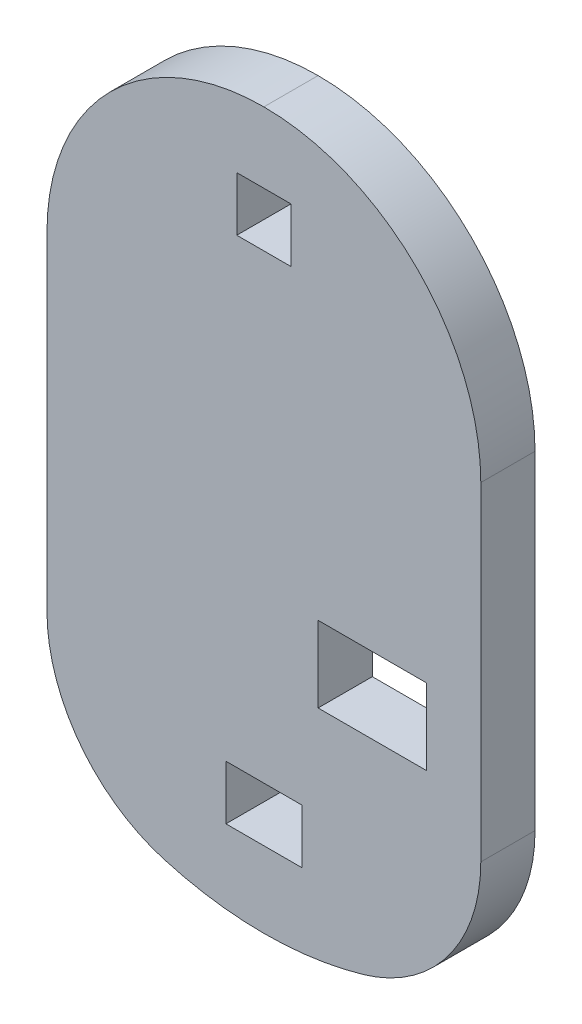
ISO-10303-21;
HEADER;
FILE_DESCRIPTION(('STEP AP214'),'2;1');
FILE_NAME('part.step','',(''),(''),'','','');
FILE_SCHEMA(('AUTOMOTIVE_DESIGN { 1 0 10303 214 1 1 1 1 }'));
ENDSEC;
DATA;
#1=APPLICATION_CONTEXT('core data for automotive mechanical design processes');
#2=APPLICATION_PROTOCOL_DEFINITION('international standard','automotive_design',2000,#1);
#3=PRODUCT_CONTEXT('',#1,'mechanical');
#4=PRODUCT('Part','Part','',(#3));
#5=PRODUCT_RELATED_PRODUCT_CATEGORY('part','',(#4));
#6=PRODUCT_DEFINITION_FORMATION('','',#4);
#7=PRODUCT_DEFINITION_CONTEXT('part definition',#1,'design');
#8=PRODUCT_DEFINITION('design','',#6,#7);
#9=PRODUCT_DEFINITION_SHAPE('','',#8);
#10=(LENGTH_UNIT() NAMED_UNIT(*) SI_UNIT(.MILLI.,.METRE.));
#11=(NAMED_UNIT(*) PLANE_ANGLE_UNIT() SI_UNIT($,.RADIAN.));
#12=(NAMED_UNIT(*) SI_UNIT($,.STERADIAN.) SOLID_ANGLE_UNIT());
#13=UNCERTAINTY_MEASURE_WITH_UNIT(LENGTH_MEASURE(1.E-05),#10,'distance_accuracy_value','');
#14=(GEOMETRIC_REPRESENTATION_CONTEXT(3) GLOBAL_UNCERTAINTY_ASSIGNED_CONTEXT((#13)) GLOBAL_UNIT_ASSIGNED_CONTEXT((#10,
#11,#12)) REPRESENTATION_CONTEXT('',''));
#15=CARTESIAN_POINT('',(0.,0.,0.));
#16=DIRECTION('',(0.,0.,1.));
#17=DIRECTION('',(1.,0.,0.));
#18=AXIS2_PLACEMENT_3D('',#15,#16,#17);
#19=CARTESIAN_POINT('',(0.,0.,5.));
#20=DIRECTION('',(0.,0.,-1.));
#21=DIRECTION('',(-1.,0.,0.));
#22=AXIS2_PLACEMENT_3D('',#19,#20,#21);
#23=CYLINDRICAL_SURFACE('',#22,33.);
#24=CARTESIAN_POINT('',(0.,0.,0.));
#25=DIRECTION('',(0.,0.,1.));
#26=DIRECTION('',(1.,0.,0.));
#27=AXIS2_PLACEMENT_3D('',#24,#25,#26);
#28=CIRCLE('',#27,33.);
#29=CARTESIAN_POINT('',(-9.16666666666666,-31.7012968539494,0.));
#30=VERTEX_POINT('',#29);
#31=CARTESIAN_POINT('',(9.16666666666667,-31.7012968539494,0.));
#32=VERTEX_POINT('',#31);
#33=EDGE_CURVE('E243',#30,#32,#28,.T.);
#34=ORIENTED_EDGE('',*,*,#33,.T.);
#35=DIRECTION('',(0.,0.,-1.));
#36=VECTOR('',#35,1.);
#37=CARTESIAN_POINT('',(9.16666666666667,-31.7012968539494,5.));
#38=LINE('',#37,#36);
#39=CARTESIAN_POINT('',(9.16666666666667,-31.7012968539494,5.));
#40=VERTEX_POINT('',#39);
#41=EDGE_CURVE('E275',#32,#40,#38,.F.);
#42=ORIENTED_EDGE('',*,*,#41,.T.);
#43=CARTESIAN_POINT('',(0.,0.,5.));
#44=DIRECTION('',(0.,0.,1.));
#45=DIRECTION('',(1.,0.,0.));
#46=AXIS2_PLACEMENT_3D('',#43,#44,#45);
#47=CIRCLE('',#46,33.);
#48=CARTESIAN_POINT('',(-9.16666666666666,-31.7012968539494,5.));
#49=VERTEX_POINT('',#48);
#50=EDGE_CURVE('E247',#49,#40,#47,.T.);
#51=ORIENTED_EDGE('',*,*,#50,.F.);
#52=DIRECTION('',(0.,0.,-1.));
#53=VECTOR('',#52,1.);
#54=CARTESIAN_POINT('',(-9.16666666666666,-31.7012968539494,5.));
#55=LINE('',#54,#53);
#56=EDGE_CURVE('E271',#49,#30,#55,.T.);
#57=ORIENTED_EDGE('',*,*,#56,.T.);
#58=EDGE_LOOP('',(#34,#42,#51,#57));
#59=FACE_BOUND('',#58,.T.);
#60=ADVANCED_FACE('F41',(#59),#23,.T.);
#61=CARTESIAN_POINT('',(0.,0.,5.));
#62=DIRECTION('',(0.,0.,1.));
#63=DIRECTION('',(1.,0.,0.));
#64=AXIS2_PLACEMENT_3D('',#61,#62,#63);
#65=PLANE('',#64);
#66=DIRECTION('',(0.,-1.,0.));
#67=VECTOR('',#66,1.);
#68=CARTESIAN_POINT('',(5.,-5.5,5.));
#69=LINE('',#68,#67);
#70=CARTESIAN_POINT('',(5.,-5.5,5.));
#71=VERTEX_POINT('',#70);
#72=CARTESIAN_POINT('',(5.,-12.5,5.));
#73=VERTEX_POINT('',#72);
#74=EDGE_CURVE('E56',#71,#73,#69,.T.);
#75=ORIENTED_EDGE('',*,*,#74,.F.);
#76=DIRECTION('',(-1.,0.,0.));
#77=VECTOR('',#76,1.);
#78=CARTESIAN_POINT('',(5.,-5.5,5.));
#79=LINE('',#78,#77);
#80=CARTESIAN_POINT('',(15.,-5.5,5.));
#81=VERTEX_POINT('',#80);
#82=EDGE_CURVE('E191',#81,#71,#79,.T.);
#83=ORIENTED_EDGE('',*,*,#82,.F.);
#84=DIRECTION('',(0.,1.,0.));
#85=VECTOR('',#84,1.);
#86=CARTESIAN_POINT('',(15.,-5.5,5.));
#87=LINE('',#86,#85);
#88=CARTESIAN_POINT('',(15.,-12.5,5.));
#89=VERTEX_POINT('',#88);
#90=EDGE_CURVE('E175',#89,#81,#87,.T.);
#91=ORIENTED_EDGE('',*,*,#90,.F.);
#92=DIRECTION('',(1.,0.,0.));
#93=VECTOR('',#92,1.);
#94=CARTESIAN_POINT('',(5.,-12.5,5.));
#95=LINE('',#94,#93);
#96=EDGE_CURVE('E184',#73,#89,#95,.T.);
#97=ORIENTED_EDGE('',*,*,#96,.F.);
#98=EDGE_LOOP('',(#75,#83,#91,#97));
#99=FACE_BOUND('',#98,.T.);
#100=DIRECTION('',(0.,-1.,0.));
#101=VECTOR('',#100,1.);
#102=CARTESIAN_POINT('',(-2.5,26.5,5.));
#103=LINE('',#102,#101);
#104=CARTESIAN_POINT('',(-2.5,26.5,5.));
#105=VERTEX_POINT('',#104);
#106=CARTESIAN_POINT('',(-2.5,21.5,5.));
#107=VERTEX_POINT('',#106);
#108=EDGE_CURVE('E201',#105,#107,#103,.T.);
#109=ORIENTED_EDGE('',*,*,#108,.F.);
#110=DIRECTION('',(-1.,0.,0.));
#111=VECTOR('',#110,1.);
#112=CARTESIAN_POINT('',(-2.5,26.5,5.));
#113=LINE('',#112,#111);
#114=CARTESIAN_POINT('',(2.5,26.5,5.));
#115=VERTEX_POINT('',#114);
#116=EDGE_CURVE('E210',#115,#105,#113,.T.);
#117=ORIENTED_EDGE('',*,*,#116,.F.);
#118=DIRECTION('',(0.,1.,0.));
#119=VECTOR('',#118,1.);
#120=CARTESIAN_POINT('',(2.5,26.5,5.));
#121=LINE('',#120,#119);
#122=CARTESIAN_POINT('',(2.5,21.5,5.));
#123=VERTEX_POINT('',#122);
#124=EDGE_CURVE('E207',#123,#115,#121,.T.);
#125=ORIENTED_EDGE('',*,*,#124,.F.);
#126=DIRECTION('',(1.,0.,0.));
#127=VECTOR('',#126,1.);
#128=CARTESIAN_POINT('',(-2.5,21.5,5.));
#129=LINE('',#128,#127);
#130=EDGE_CURVE('E203',#107,#123,#129,.T.);
#131=ORIENTED_EDGE('',*,*,#130,.F.);
#132=EDGE_LOOP('',(#109,#117,#125,#131));
#133=FACE_BOUND('',#132,.T.);
#134=DIRECTION('',(0.,-1.,0.));
#135=VECTOR('',#134,1.);
#136=CARTESIAN_POINT('',(-3.5,-21.,5.));
#137=LINE('',#136,#135);
#138=CARTESIAN_POINT('',(-3.5,-21.,5.));
#139=VERTEX_POINT('',#138);
#140=CARTESIAN_POINT('',(-3.5,-26.,5.));
#141=VERTEX_POINT('',#140);
#142=EDGE_CURVE('E198',#139,#141,#137,.T.);
#143=ORIENTED_EDGE('',*,*,#142,.F.);
#144=DIRECTION('',(-1.,0.,0.));
#145=VECTOR('',#144,1.);
#146=CARTESIAN_POINT('',(-3.5,-21.,5.));
#147=LINE('',#146,#145);
#148=CARTESIAN_POINT('',(3.5,-21.,5.));
#149=VERTEX_POINT('',#148);
#150=EDGE_CURVE('E230',#149,#139,#147,.T.);
#151=ORIENTED_EDGE('',*,*,#150,.F.);
#152=DIRECTION('',(0.,1.,0.));
#153=VECTOR('',#152,1.);
#154=CARTESIAN_POINT('',(3.5,-21.,5.));
#155=LINE('',#154,#153);
#156=CARTESIAN_POINT('',(3.5,-26.,5.));
#157=VERTEX_POINT('',#156);
#158=EDGE_CURVE('E227',#157,#149,#155,.T.);
#159=ORIENTED_EDGE('',*,*,#158,.F.);
#160=DIRECTION('',(1.,0.,0.));
#161=VECTOR('',#160,1.);
#162=CARTESIAN_POINT('',(-3.5,-26.,5.));
#163=LINE('',#162,#161);
#164=EDGE_CURVE('E224',#141,#157,#163,.T.);
#165=ORIENTED_EDGE('',*,*,#164,.F.);
#166=EDGE_LOOP('',(#143,#151,#159,#165));
#167=FACE_BOUND('',#166,.T.);
#168=ORIENTED_EDGE('',*,*,#50,.T.);
#169=CARTESIAN_POINT('',(5.,-17.2916164657906,5.));
#170=DIRECTION('',(0.,0.,1.));
#171=DIRECTION('',(1.,0.,0.));
#172=AXIS2_PLACEMENT_3D('',#169,#170,#171);
#173=CIRCLE('',#172,15.);
#174=CARTESIAN_POINT('',(20.,-17.2916164657906,5.));
#175=VERTEX_POINT('',#174);
#176=EDGE_CURVE('E280',#40,#175,#173,.T.);
#177=ORIENTED_EDGE('',*,*,#176,.T.);
#178=DIRECTION('',(0.,-1.,0.));
#179=VECTOR('',#178,1.);
#180=CARTESIAN_POINT('',(20.,-26.2488094968134,5.));
#181=LINE('',#180,#179);
#182=CARTESIAN_POINT('',(20.,13.,5.));
#183=VERTEX_POINT('',#182);
#184=EDGE_CURVE('E244',#183,#175,#181,.T.);
#185=ORIENTED_EDGE('',*,*,#184,.F.);
#186=CARTESIAN_POINT('',(0.,13.,5.));
#187=DIRECTION('',(0.,0.,1.));
#188=DIRECTION('',(1.,0.,0.));
#189=AXIS2_PLACEMENT_3D('',#186,#187,#188);
#190=CIRCLE('',#189,20.);
#191=CARTESIAN_POINT('',(0.,33.,5.));
#192=VERTEX_POINT('',#191);
#193=EDGE_CURVE('E257',#183,#192,#190,.T.);
#194=ORIENTED_EDGE('',*,*,#193,.T.);
#195=CARTESIAN_POINT('',(0.,13.,5.));
#196=DIRECTION('',(0.,0.,1.));
#197=DIRECTION('',(1.,0.,0.));
#198=AXIS2_PLACEMENT_3D('',#195,#196,#197);
#199=CIRCLE('',#198,20.);
#200=CARTESIAN_POINT('',(-20.,13.,5.));
#201=VERTEX_POINT('',#200);
#202=EDGE_CURVE('E259',#192,#201,#199,.T.);
#203=ORIENTED_EDGE('',*,*,#202,.T.);
#204=DIRECTION('',(0.,1.,0.));
#205=VECTOR('',#204,1.);
#206=CARTESIAN_POINT('',(-20.,26.2488094968134,5.));
#207=LINE('',#206,#205);
#208=CARTESIAN_POINT('',(-20.,-17.2916164657906,5.));
#209=VERTEX_POINT('',#208);
#210=EDGE_CURVE('E241',#209,#201,#207,.T.);
#211=ORIENTED_EDGE('',*,*,#210,.F.);
#212=CARTESIAN_POINT('',(-5.,-17.2916164657906,5.));
#213=DIRECTION('',(0.,0.,1.));
#214=DIRECTION('',(1.,0.,0.));
#215=AXIS2_PLACEMENT_3D('',#212,#213,#214);
#216=CIRCLE('',#215,15.);
#217=EDGE_CURVE('E278',#209,#49,#216,.T.);
#218=ORIENTED_EDGE('',*,*,#217,.T.);
#219=EDGE_LOOP('',(#168,#177,#185,#194,#203,#211,#218));
#220=FACE_BOUND('',#219,.T.);
#221=ADVANCED_FACE('F188',(#99,#133,#167,#220),#65,.T.);
#222=CARTESIAN_POINT('',(0.,0.,0.));
#223=DIRECTION('',(0.,0.,1.));
#224=DIRECTION('',(1.,0.,0.));
#225=AXIS2_PLACEMENT_3D('',#222,#223,#224);
#226=PLANE('',#225);
#227=DIRECTION('',(-1.,0.,0.));
#228=VECTOR('',#227,1.);
#229=CARTESIAN_POINT('',(0.,-5.5,0.));
#230=LINE('',#229,#228);
#231=CARTESIAN_POINT('',(15.,-5.5,0.));
#232=VERTEX_POINT('',#231);
#233=CARTESIAN_POINT('',(5.,-5.5,0.));
#234=VERTEX_POINT('',#233);
#235=EDGE_CURVE('E49',#232,#234,#230,.T.);
#236=ORIENTED_EDGE('',*,*,#235,.T.);
#237=DIRECTION('',(0.,-1.,0.));
#238=VECTOR('',#237,1.);
#239=CARTESIAN_POINT('',(5.,0.,0.));
#240=LINE('',#239,#238);
#241=CARTESIAN_POINT('',(5.,-12.5,0.));
#242=VERTEX_POINT('',#241);
#243=EDGE_CURVE('E11',#234,#242,#240,.T.);
#244=ORIENTED_EDGE('',*,*,#243,.T.);
#245=DIRECTION('',(1.,0.,0.));
#246=VECTOR('',#245,1.);
#247=CARTESIAN_POINT('',(0.,-12.5,0.));
#248=LINE('',#247,#246);
#249=CARTESIAN_POINT('',(15.,-12.5,0.));
#250=VERTEX_POINT('',#249);
#251=EDGE_CURVE('E315',#242,#250,#248,.T.);
#252=ORIENTED_EDGE('',*,*,#251,.T.);
#253=DIRECTION('',(0.,1.,0.));
#254=VECTOR('',#253,1.);
#255=CARTESIAN_POINT('',(15.,0.,0.));
#256=LINE('',#255,#254);
#257=EDGE_CURVE('E178',#250,#232,#256,.T.);
#258=ORIENTED_EDGE('',*,*,#257,.T.);
#259=EDGE_LOOP('',(#236,#244,#252,#258));
#260=FACE_BOUND('',#259,.T.);
#261=DIRECTION('',(-1.,0.,0.));
#262=VECTOR('',#261,1.);
#263=CARTESIAN_POINT('',(0.,26.5,0.));
#264=LINE('',#263,#262);
#265=CARTESIAN_POINT('',(2.5,26.5,0.));
#266=VERTEX_POINT('',#265);
#267=CARTESIAN_POINT('',(-2.5,26.5,0.));
#268=VERTEX_POINT('',#267);
#269=EDGE_CURVE('E309',#266,#268,#264,.T.);
#270=ORIENTED_EDGE('',*,*,#269,.T.);
#271=DIRECTION('',(0.,-1.,0.));
#272=VECTOR('',#271,1.);
#273=CARTESIAN_POINT('',(-2.5,0.,0.));
#274=LINE('',#273,#272);
#275=CARTESIAN_POINT('',(-2.5,21.5,0.));
#276=VERTEX_POINT('',#275);
#277=EDGE_CURVE('E312',#268,#276,#274,.T.);
#278=ORIENTED_EDGE('',*,*,#277,.T.);
#279=DIRECTION('',(1.,0.,0.));
#280=VECTOR('',#279,1.);
#281=CARTESIAN_POINT('',(0.,21.5,0.));
#282=LINE('',#281,#280);
#283=CARTESIAN_POINT('',(2.5,21.5,0.));
#284=VERTEX_POINT('',#283);
#285=EDGE_CURVE('E303',#276,#284,#282,.T.);
#286=ORIENTED_EDGE('',*,*,#285,.T.);
#287=DIRECTION('',(0.,1.,0.));
#288=VECTOR('',#287,1.);
#289=CARTESIAN_POINT('',(2.5,0.,0.));
#290=LINE('',#289,#288);
#291=EDGE_CURVE('E306',#284,#266,#290,.T.);
#292=ORIENTED_EDGE('',*,*,#291,.T.);
#293=EDGE_LOOP('',(#270,#278,#286,#292));
#294=FACE_BOUND('',#293,.T.);
#295=DIRECTION('',(-1.,0.,0.));
#296=VECTOR('',#295,1.);
#297=CARTESIAN_POINT('',(0.,-21.,0.));
#298=LINE('',#297,#296);
#299=CARTESIAN_POINT('',(3.5,-21.,0.));
#300=VERTEX_POINT('',#299);
#301=CARTESIAN_POINT('',(-3.5,-21.,0.));
#302=VERTEX_POINT('',#301);
#303=EDGE_CURVE('E297',#300,#302,#298,.T.);
#304=ORIENTED_EDGE('',*,*,#303,.T.);
#305=DIRECTION('',(0.,-1.,0.));
#306=VECTOR('',#305,1.);
#307=CARTESIAN_POINT('',(-3.5,0.,0.));
#308=LINE('',#307,#306);
#309=CARTESIAN_POINT('',(-3.5,-26.,0.));
#310=VERTEX_POINT('',#309);
#311=EDGE_CURVE('E300',#302,#310,#308,.T.);
#312=ORIENTED_EDGE('',*,*,#311,.T.);
#313=DIRECTION('',(1.,0.,0.));
#314=VECTOR('',#313,1.);
#315=CARTESIAN_POINT('',(0.,-26.,0.));
#316=LINE('',#315,#314);
#317=CARTESIAN_POINT('',(3.5,-26.,0.));
#318=VERTEX_POINT('',#317);
#319=EDGE_CURVE('E291',#310,#318,#316,.T.);
#320=ORIENTED_EDGE('',*,*,#319,.T.);
#321=DIRECTION('',(0.,1.,0.));
#322=VECTOR('',#321,1.);
#323=CARTESIAN_POINT('',(3.5,0.,0.));
#324=LINE('',#323,#322);
#325=EDGE_CURVE('E294',#318,#300,#324,.T.);
#326=ORIENTED_EDGE('',*,*,#325,.T.);
#327=EDGE_LOOP('',(#304,#312,#320,#326));
#328=FACE_BOUND('',#327,.T.);
#329=DIRECTION('',(0.,-1.,0.));
#330=VECTOR('',#329,1.);
#331=CARTESIAN_POINT('',(20.,0.,0.));
#332=LINE('',#331,#330);
#333=CARTESIAN_POINT('',(20.,13.,0.));
#334=VERTEX_POINT('',#333);
#335=CARTESIAN_POINT('',(20.,-17.2916164657906,0.));
#336=VERTEX_POINT('',#335);
#337=EDGE_CURVE('E250',#334,#336,#332,.T.);
#338=ORIENTED_EDGE('',*,*,#337,.T.);
#339=CARTESIAN_POINT('',(5.,-17.2916164657906,0.));
#340=DIRECTION('',(0.,0.,1.));
#341=DIRECTION('',(1.,0.,0.));
#342=AXIS2_PLACEMENT_3D('',#339,#340,#341);
#343=CIRCLE('',#342,15.);
#344=EDGE_CURVE('E286',#336,#32,#343,.F.);
#345=ORIENTED_EDGE('',*,*,#344,.T.);
#346=ORIENTED_EDGE('',*,*,#33,.F.);
#347=CARTESIAN_POINT('',(-5.,-17.2916164657906,0.));
#348=DIRECTION('',(0.,0.,1.));
#349=DIRECTION('',(1.,0.,0.));
#350=AXIS2_PLACEMENT_3D('',#347,#348,#349);
#351=CIRCLE('',#350,15.);
#352=CARTESIAN_POINT('',(-20.,-17.2916164657906,0.));
#353=VERTEX_POINT('',#352);
#354=EDGE_CURVE('E284',#30,#353,#351,.F.);
#355=ORIENTED_EDGE('',*,*,#354,.T.);
#356=DIRECTION('',(0.,1.,0.));
#357=VECTOR('',#356,1.);
#358=CARTESIAN_POINT('',(-20.,0.,0.));
#359=LINE('',#358,#357);
#360=CARTESIAN_POINT('',(-20.,13.,0.));
#361=VERTEX_POINT('',#360);
#362=EDGE_CURVE('E255',#353,#361,#359,.T.);
#363=ORIENTED_EDGE('',*,*,#362,.T.);
#364=CARTESIAN_POINT('',(0.,13.,0.));
#365=DIRECTION('',(0.,0.,1.));
#366=DIRECTION('',(1.,0.,0.));
#367=AXIS2_PLACEMENT_3D('',#364,#365,#366);
#368=CIRCLE('',#367,20.);
#369=CARTESIAN_POINT('',(0.,33.,0.));
#370=VERTEX_POINT('',#369);
#371=EDGE_CURVE('E267',#361,#370,#368,.F.);
#372=ORIENTED_EDGE('',*,*,#371,.T.);
#373=CARTESIAN_POINT('',(0.,13.,0.));
#374=DIRECTION('',(0.,0.,1.));
#375=DIRECTION('',(1.,0.,0.));
#376=AXIS2_PLACEMENT_3D('',#373,#374,#375);
#377=CIRCLE('',#376,20.);
#378=EDGE_CURVE('E265',#370,#334,#377,.F.);
#379=ORIENTED_EDGE('',*,*,#378,.T.);
#380=EDGE_LOOP('',(#338,#345,#346,#355,#363,#372,#379));
#381=FACE_BOUND('',#380,.T.);
#382=ADVANCED_FACE('F319',(#260,#294,#328,#381),#226,.F.);
#383=CARTESIAN_POINT('',(20.,-26.2488094968134,-5.));
#384=DIRECTION('',(-1.,0.,0.));
#385=DIRECTION('',(0.,0.,1.));
#386=AXIS2_PLACEMENT_3D('',#383,#384,#385);
#387=PLANE('',#386);
#388=ORIENTED_EDGE('',*,*,#184,.T.);
#389=DIRECTION('',(0.,0.,-1.));
#390=VECTOR('',#389,1.);
#391=CARTESIAN_POINT('',(20.,-17.2916164657906,-5.));
#392=LINE('',#391,#390);
#393=EDGE_CURVE('E282',#175,#336,#392,.T.);
#394=ORIENTED_EDGE('',*,*,#393,.T.);
#395=ORIENTED_EDGE('',*,*,#337,.F.);
#396=DIRECTION('',(0.,0.,-1.));
#397=VECTOR('',#396,1.);
#398=CARTESIAN_POINT('',(20.,13.,-5.));
#399=LINE('',#398,#397);
#400=EDGE_CURVE('E269',#334,#183,#399,.F.);
#401=ORIENTED_EDGE('',*,*,#400,.T.);
#402=EDGE_LOOP('',(#388,#394,#395,#401));
#403=FACE_BOUND('',#402,.T.);
#404=ADVANCED_FACE('F385',(#403),#387,.F.);
#405=CARTESIAN_POINT('',(-20.,26.2488094968134,-5.));
#406=DIRECTION('',(1.,0.,0.));
#407=DIRECTION('',(0.,0.,-1.));
#408=AXIS2_PLACEMENT_3D('',#405,#406,#407);
#409=PLANE('',#408);
#410=ORIENTED_EDGE('',*,*,#362,.F.);
#411=DIRECTION('',(0.,0.,-1.));
#412=VECTOR('',#411,1.);
#413=CARTESIAN_POINT('',(-20.,-17.2916164657906,-5.));
#414=LINE('',#413,#412);
#415=EDGE_CURVE('E288',#353,#209,#414,.F.);
#416=ORIENTED_EDGE('',*,*,#415,.T.);
#417=ORIENTED_EDGE('',*,*,#210,.T.);
#418=DIRECTION('',(0.,0.,-1.));
#419=VECTOR('',#418,1.);
#420=CARTESIAN_POINT('',(-20.,13.,-5.));
#421=LINE('',#420,#419);
#422=EDGE_CURVE('E262',#201,#361,#421,.T.);
#423=ORIENTED_EDGE('',*,*,#422,.T.);
#424=EDGE_LOOP('',(#410,#416,#417,#423));
#425=FACE_BOUND('',#424,.T.);
#426=ADVANCED_FACE('F354',(#425),#409,.F.);
#427=CARTESIAN_POINT('',(0.,13.,5.));
#428=DIRECTION('',(0.,0.,-1.));
#429=DIRECTION('',(-1.,0.,0.));
#430=AXIS2_PLACEMENT_3D('',#427,#428,#429);
#431=CYLINDRICAL_SURFACE('',#430,20.);
#432=ORIENTED_EDGE('',*,*,#400,.F.);
#433=ORIENTED_EDGE('',*,*,#378,.F.);
#434=DIRECTION('',(0.,0.,-1.));
#435=VECTOR('',#434,1.);
#436=CARTESIAN_POINT('',(0.,33.,5.));
#437=LINE('',#436,#435);
#438=EDGE_CURVE('E216',#192,#370,#437,.T.);
#439=ORIENTED_EDGE('',*,*,#438,.F.);
#440=ORIENTED_EDGE('',*,*,#193,.F.);
#441=EDGE_LOOP('',(#432,#433,#439,#440));
#442=FACE_BOUND('',#441,.T.);
#443=ADVANCED_FACE('F351',(#442),#431,.T.);
#444=CARTESIAN_POINT('',(0.,13.,5.));
#445=DIRECTION('',(0.,0.,-1.));
#446=DIRECTION('',(-1.,0.,0.));
#447=AXIS2_PLACEMENT_3D('',#444,#445,#446);
#448=CYLINDRICAL_SURFACE('',#447,20.);
#449=ORIENTED_EDGE('',*,*,#371,.F.);
#450=ORIENTED_EDGE('',*,*,#422,.F.);
#451=ORIENTED_EDGE('',*,*,#202,.F.);
#452=ORIENTED_EDGE('',*,*,#438,.T.);
#453=EDGE_LOOP('',(#449,#450,#451,#452));
#454=FACE_BOUND('',#453,.T.);
#455=ADVANCED_FACE('F347',(#454),#448,.T.);
#456=CARTESIAN_POINT('',(5.,-17.2916164657906,5.));
#457=DIRECTION('',(0.,0.,-1.));
#458=DIRECTION('',(-1.,0.,0.));
#459=AXIS2_PLACEMENT_3D('',#456,#457,#458);
#460=CYLINDRICAL_SURFACE('',#459,15.);
#461=ORIENTED_EDGE('',*,*,#344,.F.);
#462=ORIENTED_EDGE('',*,*,#393,.F.);
#463=ORIENTED_EDGE('',*,*,#176,.F.);
#464=ORIENTED_EDGE('',*,*,#41,.F.);
#465=EDGE_LOOP('',(#461,#462,#463,#464));
#466=FACE_BOUND('',#465,.T.);
#467=ADVANCED_FACE('F350',(#466),#460,.T.);
#468=CARTESIAN_POINT('',(-5.,-17.2916164657906,5.));
#469=DIRECTION('',(0.,0.,-1.));
#470=DIRECTION('',(-1.,0.,0.));
#471=AXIS2_PLACEMENT_3D('',#468,#469,#470);
#472=CYLINDRICAL_SURFACE('',#471,15.);
#473=ORIENTED_EDGE('',*,*,#354,.F.);
#474=ORIENTED_EDGE('',*,*,#56,.F.);
#475=ORIENTED_EDGE('',*,*,#217,.F.);
#476=ORIENTED_EDGE('',*,*,#415,.F.);
#477=EDGE_LOOP('',(#473,#474,#475,#476));
#478=FACE_BOUND('',#477,.T.);
#479=ADVANCED_FACE('F43',(#478),#472,.T.);
#480=CARTESIAN_POINT('',(-3.5,-21.,-5.));
#481=DIRECTION('',(-1.,0.,0.));
#482=DIRECTION('',(0.,0.,1.));
#483=AXIS2_PLACEMENT_3D('',#480,#481,#482);
#484=PLANE('',#483);
#485=DIRECTION('',(0.,0.,1.));
#486=VECTOR('',#485,1.);
#487=CARTESIAN_POINT('',(-3.5,-21.,-5.));
#488=LINE('',#487,#486);
#489=EDGE_CURVE('E204',#302,#139,#488,.T.);
#490=ORIENTED_EDGE('',*,*,#489,.T.);
#491=ORIENTED_EDGE('',*,*,#142,.T.);
#492=DIRECTION('',(0.,0.,1.));
#493=VECTOR('',#492,1.);
#494=CARTESIAN_POINT('',(-3.5,-26.,-5.));
#495=LINE('',#494,#493);
#496=EDGE_CURVE('E233',#310,#141,#495,.T.);
#497=ORIENTED_EDGE('',*,*,#496,.F.);
#498=ORIENTED_EDGE('',*,*,#311,.F.);
#499=EDGE_LOOP('',(#490,#491,#497,#498));
#500=FACE_BOUND('',#499,.T.);
#501=ADVANCED_FACE('F361',(#500),#484,.F.);
#502=CARTESIAN_POINT('',(-3.5,-21.,-5.));
#503=DIRECTION('',(0.,1.,0.));
#504=DIRECTION('',(0.,0.,1.));
#505=AXIS2_PLACEMENT_3D('',#502,#503,#504);
#506=PLANE('',#505);
#507=DIRECTION('',(0.,0.,1.));
#508=VECTOR('',#507,1.);
#509=CARTESIAN_POINT('',(3.5,-21.,-5.));
#510=LINE('',#509,#508);
#511=EDGE_CURVE('E235',#300,#149,#510,.T.);
#512=ORIENTED_EDGE('',*,*,#511,.T.);
#513=ORIENTED_EDGE('',*,*,#150,.T.);
#514=ORIENTED_EDGE('',*,*,#489,.F.);
#515=ORIENTED_EDGE('',*,*,#303,.F.);
#516=EDGE_LOOP('',(#512,#513,#514,#515));
#517=FACE_BOUND('',#516,.T.);
#518=ADVANCED_FACE('F397',(#517),#506,.F.);
#519=CARTESIAN_POINT('',(3.5,-21.,-5.));
#520=DIRECTION('',(1.,0.,0.));
#521=DIRECTION('',(0.,0.,-1.));
#522=AXIS2_PLACEMENT_3D('',#519,#520,#521);
#523=PLANE('',#522);
#524=DIRECTION('',(0.,0.,1.));
#525=VECTOR('',#524,1.);
#526=CARTESIAN_POINT('',(3.5,-26.,-5.));
#527=LINE('',#526,#525);
#528=EDGE_CURVE('E237',#318,#157,#527,.T.);
#529=ORIENTED_EDGE('',*,*,#528,.T.);
#530=ORIENTED_EDGE('',*,*,#158,.T.);
#531=ORIENTED_EDGE('',*,*,#511,.F.);
#532=ORIENTED_EDGE('',*,*,#325,.F.);
#533=EDGE_LOOP('',(#529,#530,#531,#532));
#534=FACE_BOUND('',#533,.T.);
#535=ADVANCED_FACE('F403',(#534),#523,.F.);
#536=CARTESIAN_POINT('',(-3.5,-26.,-5.));
#537=DIRECTION('',(0.,-1.,0.));
#538=DIRECTION('',(0.,0.,-1.));
#539=AXIS2_PLACEMENT_3D('',#536,#537,#538);
#540=PLANE('',#539);
#541=ORIENTED_EDGE('',*,*,#496,.T.);
#542=ORIENTED_EDGE('',*,*,#164,.T.);
#543=ORIENTED_EDGE('',*,*,#528,.F.);
#544=ORIENTED_EDGE('',*,*,#319,.F.);
#545=EDGE_LOOP('',(#541,#542,#543,#544));
#546=FACE_BOUND('',#545,.T.);
#547=ADVANCED_FACE('F399',(#546),#540,.F.);
#548=CARTESIAN_POINT('',(-2.5,26.5,-5.));
#549=DIRECTION('',(-1.,0.,0.));
#550=DIRECTION('',(0.,0.,1.));
#551=AXIS2_PLACEMENT_3D('',#548,#549,#550);
#552=PLANE('',#551);
#553=DIRECTION('',(0.,0.,1.));
#554=VECTOR('',#553,1.);
#555=CARTESIAN_POINT('',(-2.5,26.5,-5.));
#556=LINE('',#555,#554);
#557=EDGE_CURVE('E214',#268,#105,#556,.T.);
#558=ORIENTED_EDGE('',*,*,#557,.T.);
#559=ORIENTED_EDGE('',*,*,#108,.T.);
#560=DIRECTION('',(0.,0.,1.));
#561=VECTOR('',#560,1.);
#562=CARTESIAN_POINT('',(-2.5,21.5,-5.));
#563=LINE('',#562,#561);
#564=EDGE_CURVE('E213',#276,#107,#563,.T.);
#565=ORIENTED_EDGE('',*,*,#564,.F.);
#566=ORIENTED_EDGE('',*,*,#277,.F.);
#567=EDGE_LOOP('',(#558,#559,#565,#566));
#568=FACE_BOUND('',#567,.T.);
#569=ADVANCED_FACE('F402',(#568),#552,.F.);
#570=CARTESIAN_POINT('',(-2.5,26.5,-5.));
#571=DIRECTION('',(0.,1.,0.));
#572=DIRECTION('',(0.,0.,1.));
#573=AXIS2_PLACEMENT_3D('',#570,#571,#572);
#574=PLANE('',#573);
#575=DIRECTION('',(0.,0.,1.));
#576=VECTOR('',#575,1.);
#577=CARTESIAN_POINT('',(2.5,26.5,-5.));
#578=LINE('',#577,#576);
#579=EDGE_CURVE('E217',#266,#115,#578,.T.);
#580=ORIENTED_EDGE('',*,*,#579,.T.);
#581=ORIENTED_EDGE('',*,*,#116,.T.);
#582=ORIENTED_EDGE('',*,*,#557,.F.);
#583=ORIENTED_EDGE('',*,*,#269,.F.);
#584=EDGE_LOOP('',(#580,#581,#582,#583));
#585=FACE_BOUND('',#584,.T.);
#586=ADVANCED_FACE('F412',(#585),#574,.F.);
#587=CARTESIAN_POINT('',(2.5,26.5,-5.));
#588=DIRECTION('',(1.,0.,0.));
#589=DIRECTION('',(0.,1.,0.));
#590=AXIS2_PLACEMENT_3D('',#587,#588,#589);
#591=PLANE('',#590);
#592=DIRECTION('',(0.,0.,1.));
#593=VECTOR('',#592,1.);
#594=CARTESIAN_POINT('',(2.5,21.5,-5.));
#595=LINE('',#594,#593);
#596=EDGE_CURVE('E219',#284,#123,#595,.T.);
#597=ORIENTED_EDGE('',*,*,#596,.T.);
#598=ORIENTED_EDGE('',*,*,#124,.T.);
#599=ORIENTED_EDGE('',*,*,#579,.F.);
#600=ORIENTED_EDGE('',*,*,#291,.F.);
#601=EDGE_LOOP('',(#597,#598,#599,#600));
#602=FACE_BOUND('',#601,.T.);
#603=ADVANCED_FACE('F333',(#602),#591,.F.);
#604=CARTESIAN_POINT('',(-2.5,21.5,-5.));
#605=DIRECTION('',(0.,-1.,0.));
#606=DIRECTION('',(0.,0.,-1.));
#607=AXIS2_PLACEMENT_3D('',#604,#605,#606);
#608=PLANE('',#607);
#609=ORIENTED_EDGE('',*,*,#564,.T.);
#610=ORIENTED_EDGE('',*,*,#130,.T.);
#611=ORIENTED_EDGE('',*,*,#596,.F.);
#612=ORIENTED_EDGE('',*,*,#285,.F.);
#613=EDGE_LOOP('',(#609,#610,#611,#612));
#614=FACE_BOUND('',#613,.T.);
#615=ADVANCED_FACE('F326',(#614),#608,.F.);
#616=CARTESIAN_POINT('',(5.,-5.5,-5.));
#617=DIRECTION('',(-1.,0.,0.));
#618=DIRECTION('',(0.,-1.,0.));
#619=AXIS2_PLACEMENT_3D('',#616,#617,#618);
#620=PLANE('',#619);
#621=DIRECTION('',(0.,0.,1.));
#622=VECTOR('',#621,1.);
#623=CARTESIAN_POINT('',(5.,-5.5,-5.));
#624=LINE('',#623,#622);
#625=EDGE_CURVE('E196',#234,#71,#624,.T.);
#626=ORIENTED_EDGE('',*,*,#625,.T.);
#627=ORIENTED_EDGE('',*,*,#74,.T.);
#628=DIRECTION('',(0.,0.,1.));
#629=VECTOR('',#628,1.);
#630=CARTESIAN_POINT('',(5.,-12.5,-5.));
#631=LINE('',#630,#629);
#632=EDGE_CURVE('E181',#242,#73,#631,.T.);
#633=ORIENTED_EDGE('',*,*,#632,.F.);
#634=ORIENTED_EDGE('',*,*,#243,.F.);
#635=EDGE_LOOP('',(#626,#627,#633,#634));
#636=FACE_BOUND('',#635,.T.);
#637=ADVANCED_FACE('F324',(#636),#620,.F.);
#638=CARTESIAN_POINT('',(5.,-5.5,-5.));
#639=DIRECTION('',(0.,1.,0.));
#640=DIRECTION('',(0.,0.,1.));
#641=AXIS2_PLACEMENT_3D('',#638,#639,#640);
#642=PLANE('',#641);
#643=DIRECTION('',(0.,0.,1.));
#644=VECTOR('',#643,1.);
#645=CARTESIAN_POINT('',(15.,-5.5,-5.));
#646=LINE('',#645,#644);
#647=EDGE_CURVE('E180',#232,#81,#646,.T.);
#648=ORIENTED_EDGE('',*,*,#647,.T.);
#649=ORIENTED_EDGE('',*,*,#82,.T.);
#650=ORIENTED_EDGE('',*,*,#625,.F.);
#651=ORIENTED_EDGE('',*,*,#235,.F.);
#652=EDGE_LOOP('',(#648,#649,#650,#651));
#653=FACE_BOUND('',#652,.T.);
#654=ADVANCED_FACE('F323',(#653),#642,.F.);
#655=CARTESIAN_POINT('',(15.,-5.5,-5.));
#656=DIRECTION('',(1.,0.,0.));
#657=DIRECTION('',(0.,1.,0.));
#658=AXIS2_PLACEMENT_3D('',#655,#656,#657);
#659=PLANE('',#658);
#660=DIRECTION('',(0.,0.,1.));
#661=VECTOR('',#660,1.);
#662=CARTESIAN_POINT('',(15.,-12.5,-5.));
#663=LINE('',#662,#661);
#664=EDGE_CURVE('E64',#250,#89,#663,.T.);
#665=ORIENTED_EDGE('',*,*,#664,.T.);
#666=ORIENTED_EDGE('',*,*,#90,.T.);
#667=ORIENTED_EDGE('',*,*,#647,.F.);
#668=ORIENTED_EDGE('',*,*,#257,.F.);
#669=EDGE_LOOP('',(#665,#666,#667,#668));
#670=FACE_BOUND('',#669,.T.);
#671=ADVANCED_FACE('F172',(#670),#659,.F.);
#672=CARTESIAN_POINT('',(5.,-12.5,-5.));
#673=DIRECTION('',(0.,-1.,0.));
#674=DIRECTION('',(0.,0.,-1.));
#675=AXIS2_PLACEMENT_3D('',#672,#673,#674);
#676=PLANE('',#675);
#677=ORIENTED_EDGE('',*,*,#632,.T.);
#678=ORIENTED_EDGE('',*,*,#96,.T.);
#679=ORIENTED_EDGE('',*,*,#664,.F.);
#680=ORIENTED_EDGE('',*,*,#251,.F.);
#681=EDGE_LOOP('',(#677,#678,#679,#680));
#682=FACE_BOUND('',#681,.T.);
#683=ADVANCED_FACE('F185',(#682),#676,.F.);
#684=CLOSED_SHELL('',(#60,#221,#382,#404,#426,#443,#455,#467,#479,#501,#518,#535,#547,#569,#586,
#603,#615,#637,#654,#671,#683));
#685=MANIFOLD_SOLID_BREP('B2',#684);
#686=ADVANCED_BREP_SHAPE_REPRESENTATION('',(#18,#685),#14);
#687=SHAPE_DEFINITION_REPRESENTATION(#9,#686);
ENDSEC;
END-ISO-10303-21;
